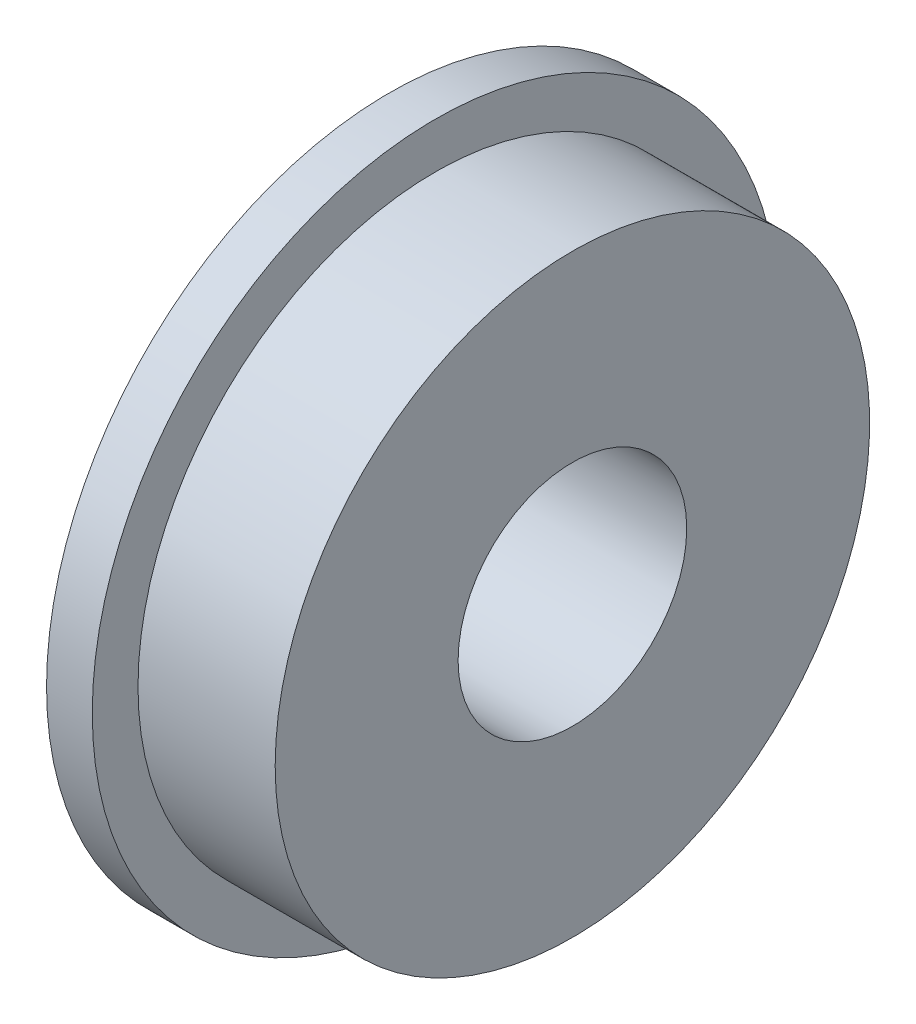
ISO-10303-21;
HEADER;
FILE_DESCRIPTION(('STEP AP214'),'2;1');
FILE_NAME('part.step','',(''),(''),'','','');
FILE_SCHEMA(('AUTOMOTIVE_DESIGN { 1 0 10303 214 1 1 1 1 }'));
ENDSEC;
DATA;
#1=APPLICATION_CONTEXT('core data for automotive mechanical design processes');
#2=APPLICATION_PROTOCOL_DEFINITION('international standard','automotive_design',2000,#1);
#3=PRODUCT_CONTEXT('',#1,'mechanical');
#4=PRODUCT('Part','Part','',(#3));
#5=PRODUCT_RELATED_PRODUCT_CATEGORY('part','',(#4));
#6=PRODUCT_DEFINITION_FORMATION('','',#4);
#7=PRODUCT_DEFINITION_CONTEXT('part definition',#1,'design');
#8=PRODUCT_DEFINITION('design','',#6,#7);
#9=PRODUCT_DEFINITION_SHAPE('','',#8);
#10=(LENGTH_UNIT() NAMED_UNIT(*) SI_UNIT(.MILLI.,.METRE.));
#11=(NAMED_UNIT(*) PLANE_ANGLE_UNIT() SI_UNIT($,.RADIAN.));
#12=(NAMED_UNIT(*) SI_UNIT($,.STERADIAN.) SOLID_ANGLE_UNIT());
#13=UNCERTAINTY_MEASURE_WITH_UNIT(LENGTH_MEASURE(1.E-05),#10,'distance_accuracy_value','');
#14=(GEOMETRIC_REPRESENTATION_CONTEXT(3) GLOBAL_UNCERTAINTY_ASSIGNED_CONTEXT((#13)) GLOBAL_UNIT_ASSIGNED_CONTEXT((#10,
#11,#12)) REPRESENTATION_CONTEXT('',''));
#15=CARTESIAN_POINT('',(0.,0.,0.));
#16=DIRECTION('',(0.,0.,1.));
#17=DIRECTION('',(1.,0.,0.));
#18=AXIS2_PLACEMENT_3D('',#15,#16,#17);
#19=CARTESIAN_POINT('',(4.,0.,-6.5));
#20=DIRECTION('',(-1.,0.,0.));
#21=DIRECTION('',(0.,0.,1.));
#22=AXIS2_PLACEMENT_3D('',#19,#20,#21);
#23=PLANE('',#22);
#24=CARTESIAN_POINT('',(4.,0.,0.));
#25=DIRECTION('',(-1.,0.,0.));
#26=DIRECTION('',(0.,0.,1.));
#27=AXIS2_PLACEMENT_3D('',#24,#25,#26);
#28=CIRCLE('',#27,6.5);
#29=CARTESIAN_POINT('',(4.,0.,6.5));
#30=VERTEX_POINT('',#29);
#31=EDGE_CURVE('E55',#30,#30,#28,.T.);
#32=ORIENTED_EDGE('',*,*,#31,.F.);
#33=EDGE_LOOP('',(#32));
#34=FACE_BOUND('',#33,.T.);
#35=CARTESIAN_POINT('',(4.,0.,0.));
#36=DIRECTION('',(-1.,0.,0.));
#37=DIRECTION('',(0.,0.,1.));
#38=AXIS2_PLACEMENT_3D('',#35,#36,#37);
#39=CIRCLE('',#38,2.5);
#40=CARTESIAN_POINT('',(4.,0.,2.5));
#41=VERTEX_POINT('',#40);
#42=EDGE_CURVE('E10',#41,#41,#39,.T.);
#43=ORIENTED_EDGE('',*,*,#42,.T.);
#44=EDGE_LOOP('',(#43));
#45=FACE_BOUND('',#44,.T.);
#46=ADVANCED_FACE('F33',(#34,#45),#23,.F.);
#47=CARTESIAN_POINT('',(0.,0.,0.));
#48=DIRECTION('',(-1.,0.,0.));
#49=DIRECTION('',(0.,0.,1.));
#50=AXIS2_PLACEMENT_3D('',#47,#48,#49);
#51=CYLINDRICAL_SURFACE('',#50,2.5);
#52=ORIENTED_EDGE('',*,*,#42,.F.);
#53=EDGE_LOOP('',(#52));
#54=FACE_BOUND('',#53,.T.);
#55=CARTESIAN_POINT('',(0.,0.,0.));
#56=DIRECTION('',(-1.,0.,0.));
#57=DIRECTION('',(0.,0.,1.));
#58=AXIS2_PLACEMENT_3D('',#55,#56,#57);
#59=CIRCLE('',#58,2.5);
#60=CARTESIAN_POINT('',(0.,0.,2.5));
#61=VERTEX_POINT('',#60);
#62=EDGE_CURVE('E39',#61,#61,#59,.T.);
#63=ORIENTED_EDGE('',*,*,#62,.T.);
#64=EDGE_LOOP('',(#63));
#65=FACE_BOUND('',#64,.T.);
#66=ADVANCED_FACE('F62',(#54,#65),#51,.F.);
#67=CARTESIAN_POINT('',(0.,0.,-2.5));
#68=DIRECTION('',(1.,0.,0.));
#69=DIRECTION('',(0.,0.,-1.));
#70=AXIS2_PLACEMENT_3D('',#67,#68,#69);
#71=PLANE('',#70);
#72=ORIENTED_EDGE('',*,*,#62,.F.);
#73=EDGE_LOOP('',(#72));
#74=FACE_BOUND('',#73,.T.);
#75=CARTESIAN_POINT('',(0.,0.,0.));
#76=DIRECTION('',(-1.,0.,0.));
#77=DIRECTION('',(0.,0.,1.));
#78=AXIS2_PLACEMENT_3D('',#75,#76,#77);
#79=CIRCLE('',#78,7.5);
#80=CARTESIAN_POINT('',(0.,0.,7.5));
#81=VERTEX_POINT('',#80);
#82=EDGE_CURVE('E43',#81,#81,#79,.T.);
#83=ORIENTED_EDGE('',*,*,#82,.T.);
#84=EDGE_LOOP('',(#83));
#85=FACE_BOUND('',#84,.T.);
#86=ADVANCED_FACE('F66',(#74,#85),#71,.F.);
#87=CARTESIAN_POINT('',(0.,0.,0.));
#88=DIRECTION('',(-1.,0.,0.));
#89=DIRECTION('',(0.,0.,1.));
#90=AXIS2_PLACEMENT_3D('',#87,#88,#89);
#91=CYLINDRICAL_SURFACE('',#90,7.5);
#92=ORIENTED_EDGE('',*,*,#82,.F.);
#93=EDGE_LOOP('',(#92));
#94=FACE_BOUND('',#93,.T.);
#95=CARTESIAN_POINT('',(1.,0.,0.));
#96=DIRECTION('',(-1.,0.,0.));
#97=DIRECTION('',(0.,0.,1.));
#98=AXIS2_PLACEMENT_3D('',#95,#96,#97);
#99=CIRCLE('',#98,7.5);
#100=CARTESIAN_POINT('',(1.,0.,7.5));
#101=VERTEX_POINT('',#100);
#102=EDGE_CURVE('E47',#101,#101,#99,.T.);
#103=ORIENTED_EDGE('',*,*,#102,.T.);
#104=EDGE_LOOP('',(#103));
#105=FACE_BOUND('',#104,.T.);
#106=ADVANCED_FACE('F71',(#94,#105),#91,.T.);
#107=CARTESIAN_POINT('',(1.,0.,-7.5));
#108=DIRECTION('',(-1.,0.,0.));
#109=DIRECTION('',(0.,0.,1.));
#110=AXIS2_PLACEMENT_3D('',#107,#108,#109);
#111=PLANE('',#110);
#112=ORIENTED_EDGE('',*,*,#102,.F.);
#113=EDGE_LOOP('',(#112));
#114=FACE_BOUND('',#113,.T.);
#115=CARTESIAN_POINT('',(1.,0.,0.));
#116=DIRECTION('',(-1.,0.,0.));
#117=DIRECTION('',(0.,0.,1.));
#118=AXIS2_PLACEMENT_3D('',#115,#116,#117);
#119=CIRCLE('',#118,6.5);
#120=CARTESIAN_POINT('',(1.,0.,6.5));
#121=VERTEX_POINT('',#120);
#122=EDGE_CURVE('E52',#121,#121,#119,.T.);
#123=ORIENTED_EDGE('',*,*,#122,.T.);
#124=EDGE_LOOP('',(#123));
#125=FACE_BOUND('',#124,.T.);
#126=ADVANCED_FACE('F77',(#114,#125),#111,.F.);
#127=CARTESIAN_POINT('',(0.,0.,0.));
#128=DIRECTION('',(-1.,0.,0.));
#129=DIRECTION('',(0.,0.,1.));
#130=AXIS2_PLACEMENT_3D('',#127,#128,#129);
#131=CYLINDRICAL_SURFACE('',#130,6.5);
#132=ORIENTED_EDGE('',*,*,#122,.F.);
#133=EDGE_LOOP('',(#132));
#134=FACE_BOUND('',#133,.T.);
#135=ORIENTED_EDGE('',*,*,#31,.T.);
#136=EDGE_LOOP('',(#135));
#137=FACE_BOUND('',#136,.T.);
#138=ADVANCED_FACE('F59',(#134,#137),#131,.T.);
#139=CLOSED_SHELL('',(#46,#66,#86,#106,#126,#138));
#140=MANIFOLD_SOLID_BREP('B2',#139);
#141=ADVANCED_BREP_SHAPE_REPRESENTATION('',(#18,#140),#14);
#142=SHAPE_DEFINITION_REPRESENTATION(#9,#141);
ENDSEC;
END-ISO-10303-21;
